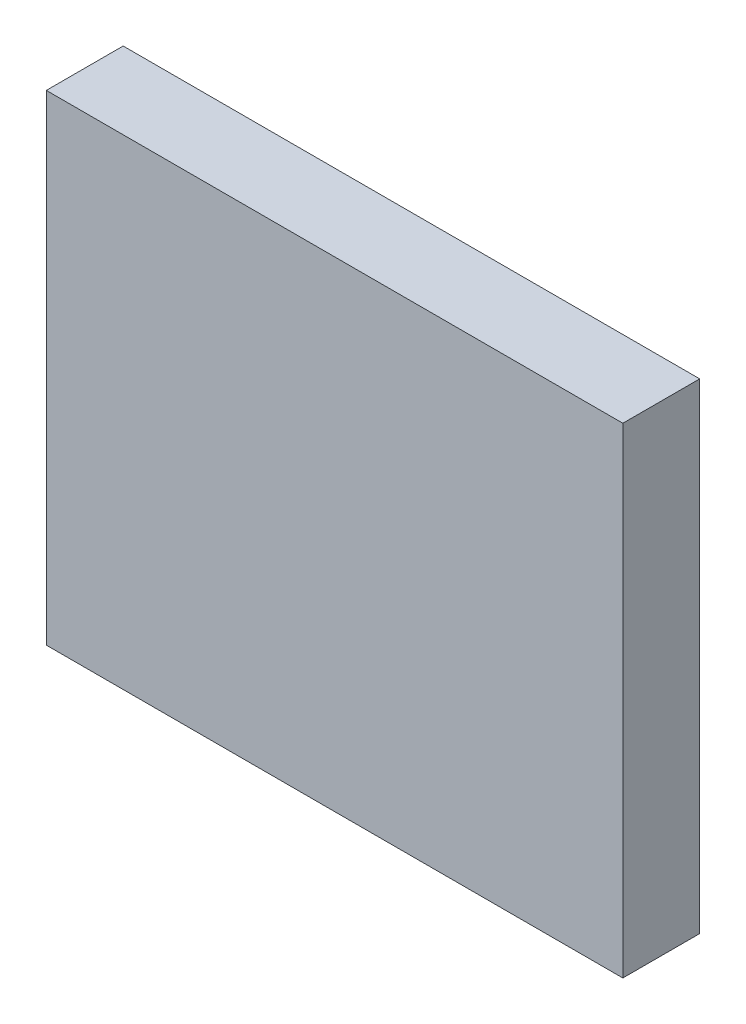
ISO-10303-21;
HEADER;
FILE_DESCRIPTION(('STEP AP214'),'2;1');
FILE_NAME('part.step','',(''),(''),'','','');
FILE_SCHEMA(('AUTOMOTIVE_DESIGN { 1 0 10303 214 1 1 1 1 }'));
ENDSEC;
DATA;
#1=APPLICATION_CONTEXT('core data for automotive mechanical design processes');
#2=APPLICATION_PROTOCOL_DEFINITION('international standard','automotive_design',2000,#1);
#3=PRODUCT_CONTEXT('',#1,'mechanical');
#4=PRODUCT('Part','Part','',(#3));
#5=PRODUCT_RELATED_PRODUCT_CATEGORY('part','',(#4));
#6=PRODUCT_DEFINITION_FORMATION('','',#4);
#7=PRODUCT_DEFINITION_CONTEXT('part definition',#1,'design');
#8=PRODUCT_DEFINITION('design','',#6,#7);
#9=PRODUCT_DEFINITION_SHAPE('','',#8);
#10=(LENGTH_UNIT() NAMED_UNIT(*) SI_UNIT(.MILLI.,.METRE.));
#11=(NAMED_UNIT(*) PLANE_ANGLE_UNIT() SI_UNIT($,.RADIAN.));
#12=(NAMED_UNIT(*) SI_UNIT($,.STERADIAN.) SOLID_ANGLE_UNIT());
#13=UNCERTAINTY_MEASURE_WITH_UNIT(LENGTH_MEASURE(1.E-05),#10,'distance_accuracy_value','');
#14=(GEOMETRIC_REPRESENTATION_CONTEXT(3) GLOBAL_UNCERTAINTY_ASSIGNED_CONTEXT((#13)) GLOBAL_UNIT_ASSIGNED_CONTEXT((#10,
#11,#12)) REPRESENTATION_CONTEXT('',''));
#15=CARTESIAN_POINT('',(0.,0.,0.));
#16=DIRECTION('',(0.,0.,1.));
#17=DIRECTION('',(1.,0.,0.));
#18=AXIS2_PLACEMENT_3D('',#15,#16,#17);
#19=CARTESIAN_POINT('',(0.,0.,4.));
#20=DIRECTION('',(1.,0.,0.));
#21=DIRECTION('',(0.,0.,-1.));
#22=AXIS2_PLACEMENT_3D('',#19,#20,#21);
#23=PLANE('',#22);
#24=DIRECTION('',(0.,-1.,0.));
#25=VECTOR('',#24,1.);
#26=CARTESIAN_POINT('',(0.,0.,0.));
#27=LINE('',#26,#25);
#28=CARTESIAN_POINT('',(0.,25.,0.));
#29=VERTEX_POINT('',#28);
#30=CARTESIAN_POINT('',(0.,0.,0.));
#31=VERTEX_POINT('',#30);
#32=EDGE_CURVE('E100',#29,#31,#27,.T.);
#33=ORIENTED_EDGE('',*,*,#32,.T.);
#34=DIRECTION('',(0.,0.,-1.));
#35=VECTOR('',#34,1.);
#36=CARTESIAN_POINT('',(0.,0.,4.));
#37=LINE('',#36,#35);
#38=CARTESIAN_POINT('',(0.,0.,4.));
#39=VERTEX_POINT('',#38);
#40=EDGE_CURVE('E11',#39,#31,#37,.T.);
#41=ORIENTED_EDGE('',*,*,#40,.F.);
#42=DIRECTION('',(0.,-1.,0.));
#43=VECTOR('',#42,1.);
#44=CARTESIAN_POINT('',(0.,0.,4.));
#45=LINE('',#44,#43);
#46=CARTESIAN_POINT('',(0.,25.,4.));
#47=VERTEX_POINT('',#46);
#48=EDGE_CURVE('E88',#47,#39,#45,.T.);
#49=ORIENTED_EDGE('',*,*,#48,.F.);
#50=DIRECTION('',(0.,0.,-1.));
#51=VECTOR('',#50,1.);
#52=CARTESIAN_POINT('',(0.,25.,4.));
#53=LINE('',#52,#51);
#54=EDGE_CURVE('E96',#47,#29,#53,.T.);
#55=ORIENTED_EDGE('',*,*,#54,.T.);
#56=EDGE_LOOP('',(#33,#41,#49,#55));
#57=FACE_BOUND('',#56,.T.);
#58=ADVANCED_FACE('F37',(#57),#23,.F.);
#59=CARTESIAN_POINT('',(0.,0.,4.));
#60=DIRECTION('',(0.,1.,0.));
#61=DIRECTION('',(0.,0.,1.));
#62=AXIS2_PLACEMENT_3D('',#59,#60,#61);
#63=PLANE('',#62);
#64=DIRECTION('',(1.,0.,0.));
#65=VECTOR('',#64,1.);
#66=CARTESIAN_POINT('',(0.,0.,0.));
#67=LINE('',#66,#65);
#68=CARTESIAN_POINT('',(30.,0.,0.));
#69=VERTEX_POINT('',#68);
#70=EDGE_CURVE('E92',#31,#69,#67,.T.);
#71=ORIENTED_EDGE('',*,*,#70,.T.);
#72=DIRECTION('',(0.,0.,-1.));
#73=VECTOR('',#72,1.);
#74=CARTESIAN_POINT('',(30.,0.,4.));
#75=LINE('',#74,#73);
#76=CARTESIAN_POINT('',(30.,0.,4.));
#77=VERTEX_POINT('',#76);
#78=EDGE_CURVE('E45',#77,#69,#75,.T.);
#79=ORIENTED_EDGE('',*,*,#78,.F.);
#80=DIRECTION('',(1.,0.,0.));
#81=VECTOR('',#80,1.);
#82=CARTESIAN_POINT('',(0.,0.,4.));
#83=LINE('',#82,#81);
#84=EDGE_CURVE('E83',#39,#77,#83,.T.);
#85=ORIENTED_EDGE('',*,*,#84,.F.);
#86=ORIENTED_EDGE('',*,*,#40,.T.);
#87=EDGE_LOOP('',(#71,#79,#85,#86));
#88=FACE_BOUND('',#87,.T.);
#89=ADVANCED_FACE('F91',(#88),#63,.F.);
#90=CARTESIAN_POINT('',(30.,0.,4.));
#91=DIRECTION('',(-1.,0.,0.));
#92=DIRECTION('',(0.,0.,1.));
#93=AXIS2_PLACEMENT_3D('',#90,#91,#92);
#94=PLANE('',#93);
#95=DIRECTION('',(0.,1.,0.));
#96=VECTOR('',#95,1.);
#97=CARTESIAN_POINT('',(30.,0.,0.));
#98=LINE('',#97,#96);
#99=CARTESIAN_POINT('',(30.,25.,0.));
#100=VERTEX_POINT('',#99);
#101=EDGE_CURVE('E70',#69,#100,#98,.T.);
#102=ORIENTED_EDGE('',*,*,#101,.T.);
#103=DIRECTION('',(0.,0.,-1.));
#104=VECTOR('',#103,1.);
#105=CARTESIAN_POINT('',(30.,25.,4.));
#106=LINE('',#105,#104);
#107=CARTESIAN_POINT('',(30.,25.,4.));
#108=VERTEX_POINT('',#107);
#109=EDGE_CURVE('E93',#108,#100,#106,.T.);
#110=ORIENTED_EDGE('',*,*,#109,.F.);
#111=DIRECTION('',(0.,1.,0.));
#112=VECTOR('',#111,1.);
#113=CARTESIAN_POINT('',(30.,0.,4.));
#114=LINE('',#113,#112);
#115=EDGE_CURVE('E86',#77,#108,#114,.T.);
#116=ORIENTED_EDGE('',*,*,#115,.F.);
#117=ORIENTED_EDGE('',*,*,#78,.T.);
#118=EDGE_LOOP('',(#102,#110,#116,#117));
#119=FACE_BOUND('',#118,.T.);
#120=ADVANCED_FACE('F94',(#119),#94,.F.);
#121=CARTESIAN_POINT('',(0.,25.,4.));
#122=DIRECTION('',(0.,-1.,0.));
#123=DIRECTION('',(0.,0.,-1.));
#124=AXIS2_PLACEMENT_3D('',#121,#122,#123);
#125=PLANE('',#124);
#126=DIRECTION('',(-1.,0.,0.));
#127=VECTOR('',#126,1.);
#128=CARTESIAN_POINT('',(0.,25.,0.));
#129=LINE('',#128,#127);
#130=EDGE_CURVE('E76',#100,#29,#129,.T.);
#131=ORIENTED_EDGE('',*,*,#130,.T.);
#132=ORIENTED_EDGE('',*,*,#54,.F.);
#133=DIRECTION('',(-1.,0.,0.));
#134=VECTOR('',#133,1.);
#135=CARTESIAN_POINT('',(0.,25.,4.));
#136=LINE('',#135,#134);
#137=EDGE_CURVE('E53',#108,#47,#136,.T.);
#138=ORIENTED_EDGE('',*,*,#137,.F.);
#139=ORIENTED_EDGE('',*,*,#109,.T.);
#140=EDGE_LOOP('',(#131,#132,#138,#139));
#141=FACE_BOUND('',#140,.T.);
#142=ADVANCED_FACE('F107',(#141),#125,.F.);
#143=CARTESIAN_POINT('',(0.,0.,4.));
#144=DIRECTION('',(0.,0.,-1.));
#145=DIRECTION('',(-1.,0.,0.));
#146=AXIS2_PLACEMENT_3D('',#143,#144,#145);
#147=PLANE('',#146);
#148=ORIENTED_EDGE('',*,*,#48,.T.);
#149=ORIENTED_EDGE('',*,*,#84,.T.);
#150=ORIENTED_EDGE('',*,*,#115,.T.);
#151=ORIENTED_EDGE('',*,*,#137,.T.);
#152=EDGE_LOOP('',(#148,#149,#150,#151));
#153=FACE_BOUND('',#152,.T.);
#154=ADVANCED_FACE('F84',(#153),#147,.F.);
#155=CARTESIAN_POINT('',(0.,0.,0.));
#156=DIRECTION('',(0.,0.,-1.));
#157=DIRECTION('',(-1.,0.,0.));
#158=AXIS2_PLACEMENT_3D('',#155,#156,#157);
#159=PLANE('',#158);
#160=ORIENTED_EDGE('',*,*,#32,.F.);
#161=ORIENTED_EDGE('',*,*,#130,.F.);
#162=ORIENTED_EDGE('',*,*,#101,.F.);
#163=ORIENTED_EDGE('',*,*,#70,.F.);
#164=EDGE_LOOP('',(#160,#161,#162,#163));
#165=FACE_BOUND('',#164,.T.);
#166=ADVANCED_FACE('F110',(#165),#159,.T.);
#167=CLOSED_SHELL('',(#58,#89,#120,#142,#154,#166));
#168=MANIFOLD_SOLID_BREP('B2',#167);
#169=ADVANCED_BREP_SHAPE_REPRESENTATION('',(#18,#168),#14);
#170=SHAPE_DEFINITION_REPRESENTATION(#9,#169);
ENDSEC;
END-ISO-10303-21;
